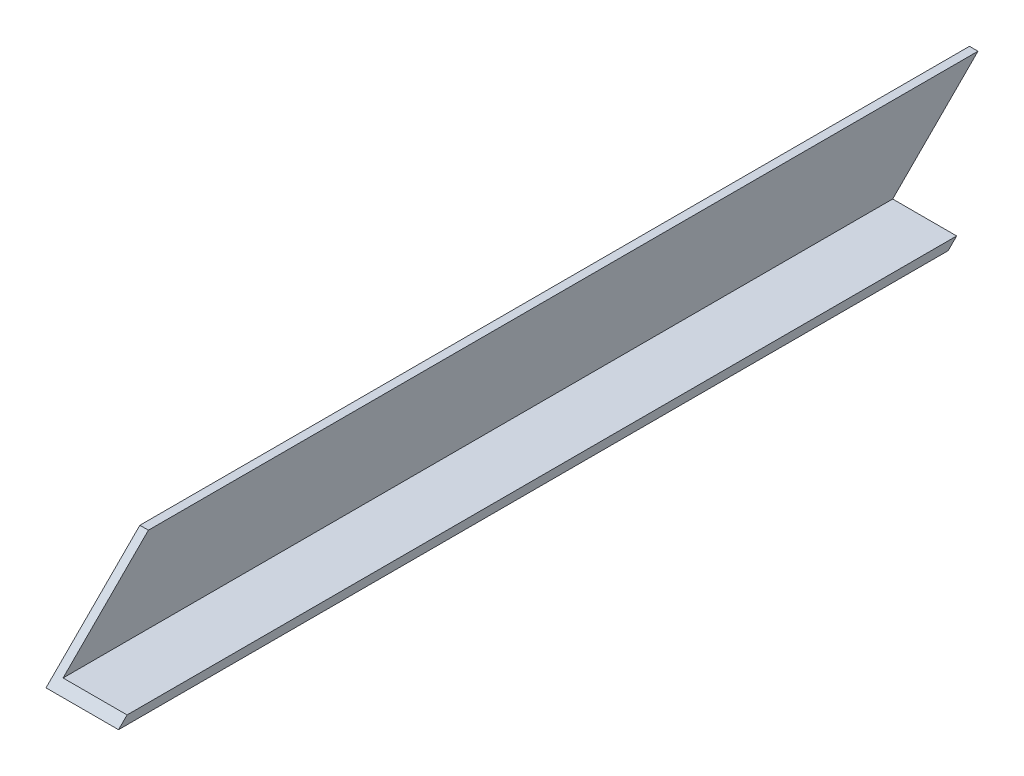
ISO-10303-21;
HEADER;
FILE_DESCRIPTION(('STEP AP214'),'2;1');
FILE_NAME('part.step','',(''),(''),'','','');
FILE_SCHEMA(('AUTOMOTIVE_DESIGN { 1 0 10303 214 1 1 1 1 }'));
ENDSEC;
DATA;
#1=APPLICATION_CONTEXT('core data for automotive mechanical design processes');
#2=APPLICATION_PROTOCOL_DEFINITION('international standard','automotive_design',2000,#1);
#3=PRODUCT_CONTEXT('',#1,'mechanical');
#4=PRODUCT('Part','Part','',(#3));
#5=PRODUCT_RELATED_PRODUCT_CATEGORY('part','',(#4));
#6=PRODUCT_DEFINITION_FORMATION('','',#4);
#7=PRODUCT_DEFINITION_CONTEXT('part definition',#1,'design');
#8=PRODUCT_DEFINITION('design','',#6,#7);
#9=PRODUCT_DEFINITION_SHAPE('','',#8);
#10=(LENGTH_UNIT() NAMED_UNIT(*) SI_UNIT(.MILLI.,.METRE.));
#11=(NAMED_UNIT(*) PLANE_ANGLE_UNIT() SI_UNIT($,.RADIAN.));
#12=(NAMED_UNIT(*) SI_UNIT($,.STERADIAN.) SOLID_ANGLE_UNIT());
#13=UNCERTAINTY_MEASURE_WITH_UNIT(LENGTH_MEASURE(1.E-05),#10,'distance_accuracy_value','');
#14=(GEOMETRIC_REPRESENTATION_CONTEXT(3) GLOBAL_UNCERTAINTY_ASSIGNED_CONTEXT((#13)) GLOBAL_UNIT_ASSIGNED_CONTEXT((#10,
#11,#12)) REPRESENTATION_CONTEXT('',''));
#15=CARTESIAN_POINT('',(0.,0.,0.));
#16=DIRECTION('',(0.,0.,1.));
#17=DIRECTION('',(1.,0.,0.));
#18=AXIS2_PLACEMENT_3D('',#15,#16,#17);
#19=CARTESIAN_POINT('',(17.,0.,250.));
#20=DIRECTION('',(0.,1.,0.));
#21=DIRECTION('',(-1.,0.,0.));
#22=AXIS2_PLACEMENT_3D('',#19,#20,#21);
#23=PLANE('',#22);
#24=DIRECTION('',(-1.,0.,0.));
#25=VECTOR('',#24,1.);
#26=CARTESIAN_POINT('',(17.,0.,55.5456351737006));
#27=LINE('',#26,#25);
#28=CARTESIAN_POINT('',(17.,0.,55.5456351737006));
#29=VERTEX_POINT('',#28);
#30=CARTESIAN_POINT('',(0.,0.,55.5456351737006));
#31=VERTEX_POINT('',#30);
#32=EDGE_CURVE('E55',#29,#31,#27,.T.);
#33=ORIENTED_EDGE('',*,*,#32,.F.);
#34=DIRECTION('',(0.,0.,-1.));
#35=VECTOR('',#34,1.);
#36=CARTESIAN_POINT('',(17.,0.,250.));
#37=LINE('',#36,#35);
#38=CARTESIAN_POINT('',(17.,0.,250.));
#39=VERTEX_POINT('',#38);
#40=EDGE_CURVE('E11',#39,#29,#37,.T.);
#41=ORIENTED_EDGE('',*,*,#40,.F.);
#42=DIRECTION('',(1.,0.,0.));
#43=VECTOR('',#42,1.);
#44=CARTESIAN_POINT('',(17.,0.,250.));
#45=LINE('',#44,#43);
#46=CARTESIAN_POINT('',(0.,0.,250.));
#47=VERTEX_POINT('',#46);
#48=EDGE_CURVE('E117',#47,#39,#45,.T.);
#49=ORIENTED_EDGE('',*,*,#48,.F.);
#50=DIRECTION('',(0.,0.,-1.));
#51=VECTOR('',#50,1.);
#52=CARTESIAN_POINT('',(0.,0.,250.));
#53=LINE('',#52,#51);
#54=EDGE_CURVE('E106',#47,#31,#53,.T.);
#55=ORIENTED_EDGE('',*,*,#54,.T.);
#56=EDGE_LOOP('',(#33,#41,#49,#55));
#57=FACE_BOUND('',#56,.T.);
#58=ADVANCED_FACE('F41',(#57),#23,.F.);
#59=CARTESIAN_POINT('',(17.,2.,250.));
#60=DIRECTION('',(-1.,0.,0.));
#61=DIRECTION('',(0.,0.,1.));
#62=AXIS2_PLACEMENT_3D('',#59,#60,#61);
#63=PLANE('',#62);
#64=DIRECTION('',(0.,0.707106781186552,-0.707106781186543));
#65=VECTOR('',#64,1.);
#66=CARTESIAN_POINT('',(17.,0.,250.));
#67=LINE('',#66,#65);
#68=CARTESIAN_POINT('',(17.,2.,248.));
#69=VERTEX_POINT('',#68);
#70=EDGE_CURVE('E99',#39,#69,#67,.T.);
#71=ORIENTED_EDGE('',*,*,#70,.F.);
#72=ORIENTED_EDGE('',*,*,#40,.T.);
#73=DIRECTION('',(0.,-0.707106781186551,0.707106781186543));
#74=VECTOR('',#73,1.);
#75=CARTESIAN_POINT('',(17.,22.,33.5456351737008));
#76=LINE('',#75,#74);
#77=CARTESIAN_POINT('',(17.,1.99999999999999,53.5456351737006));
#78=VERTEX_POINT('',#77);
#79=EDGE_CURVE('E136',#78,#29,#76,.T.);
#80=ORIENTED_EDGE('',*,*,#79,.F.);
#81=DIRECTION('',(0.,0.,-1.));
#82=VECTOR('',#81,1.);
#83=CARTESIAN_POINT('',(17.,2.,250.));
#84=LINE('',#83,#82);
#85=EDGE_CURVE('E48',#69,#78,#84,.T.);
#86=ORIENTED_EDGE('',*,*,#85,.F.);
#87=EDGE_LOOP('',(#71,#72,#80,#86));
#88=FACE_BOUND('',#87,.T.);
#89=ADVANCED_FACE('F134',(#88),#63,.F.);
#90=CARTESIAN_POINT('',(2.,2.,250.));
#91=DIRECTION('',(0.,-1.,0.));
#92=DIRECTION('',(0.,0.,-1.));
#93=AXIS2_PLACEMENT_3D('',#90,#91,#92);
#94=PLANE('',#93);
#95=DIRECTION('',(-1.,0.,0.));
#96=VECTOR('',#95,1.);
#97=CARTESIAN_POINT('',(2.,2.,248.));
#98=LINE('',#97,#96);
#99=CARTESIAN_POINT('',(2.,2.,248.));
#100=VERTEX_POINT('',#99);
#101=EDGE_CURVE('E130',#69,#100,#98,.T.);
#102=ORIENTED_EDGE('',*,*,#101,.F.);
#103=ORIENTED_EDGE('',*,*,#85,.T.);
#104=DIRECTION('',(1.,0.,0.));
#105=VECTOR('',#104,1.);
#106=CARTESIAN_POINT('',(2.00000000000003,2.,53.5456351737006));
#107=LINE('',#106,#105);
#108=CARTESIAN_POINT('',(2.,2.,53.5456351737006));
#109=VERTEX_POINT('',#108);
#110=EDGE_CURVE('E129',#109,#78,#107,.T.);
#111=ORIENTED_EDGE('',*,*,#110,.F.);
#112=DIRECTION('',(0.,0.,-1.));
#113=VECTOR('',#112,1.);
#114=CARTESIAN_POINT('',(2.,2.,250.));
#115=LINE('',#114,#113);
#116=EDGE_CURVE('E115',#100,#109,#115,.T.);
#117=ORIENTED_EDGE('',*,*,#116,.F.);
#118=EDGE_LOOP('',(#102,#103,#111,#117));
#119=FACE_BOUND('',#118,.T.);
#120=ADVANCED_FACE('F127',(#119),#94,.F.);
#121=CARTESIAN_POINT('',(2.,22.,250.));
#122=DIRECTION('',(-1.,0.,0.));
#123=DIRECTION('',(0.,-1.,0.));
#124=AXIS2_PLACEMENT_3D('',#121,#122,#123);
#125=PLANE('',#124);
#126=DIRECTION('',(0.,0.707106781186552,-0.707106781186543));
#127=VECTOR('',#126,1.);
#128=CARTESIAN_POINT('',(2.,11.0000000000001,239.));
#129=LINE('',#128,#127);
#130=CARTESIAN_POINT('',(2.,22.,228.));
#131=VERTEX_POINT('',#130);
#132=EDGE_CURVE('E94',#100,#131,#129,.T.);
#133=ORIENTED_EDGE('',*,*,#132,.F.);
#134=ORIENTED_EDGE('',*,*,#116,.T.);
#135=DIRECTION('',(0.,-0.707106781186552,0.707106781186544));
#136=VECTOR('',#135,1.);
#137=CARTESIAN_POINT('',(2.00000000000001,-86.2271824131496,141.772817586849));
#138=LINE('',#137,#136);
#139=CARTESIAN_POINT('',(2.,22.,33.5456351737008));
#140=VERTEX_POINT('',#139);
#141=EDGE_CURVE('E144',#140,#109,#138,.T.);
#142=ORIENTED_EDGE('',*,*,#141,.F.);
#143=DIRECTION('',(0.,0.,-1.));
#144=VECTOR('',#143,1.);
#145=CARTESIAN_POINT('',(2.,22.,250.));
#146=LINE('',#145,#144);
#147=EDGE_CURVE('E113',#131,#140,#146,.T.);
#148=ORIENTED_EDGE('',*,*,#147,.F.);
#149=EDGE_LOOP('',(#133,#134,#142,#148));
#150=FACE_BOUND('',#149,.T.);
#151=ADVANCED_FACE('F154',(#150),#125,.F.);
#152=CARTESIAN_POINT('',(0.,22.,250.));
#153=DIRECTION('',(0.,-1.,0.));
#154=DIRECTION('',(0.,0.,-1.));
#155=AXIS2_PLACEMENT_3D('',#152,#153,#154);
#156=PLANE('',#155);
#157=DIRECTION('',(-1.,0.,0.));
#158=VECTOR('',#157,1.);
#159=CARTESIAN_POINT('',(17.,22.,228.));
#160=LINE('',#159,#158);
#161=CARTESIAN_POINT('',(0.,22.,228.));
#162=VERTEX_POINT('',#161);
#163=EDGE_CURVE('E91',#131,#162,#160,.T.);
#164=ORIENTED_EDGE('',*,*,#163,.F.);
#165=ORIENTED_EDGE('',*,*,#147,.T.);
#166=DIRECTION('',(-1.,0.,0.));
#167=VECTOR('',#166,1.);
#168=CARTESIAN_POINT('',(17.,22.,33.5456351737008));
#169=LINE('',#168,#167);
#170=CARTESIAN_POINT('',(0.,22.,33.5456351737008));
#171=VERTEX_POINT('',#170);
#172=EDGE_CURVE('E112',#140,#171,#169,.T.);
#173=ORIENTED_EDGE('',*,*,#172,.T.);
#174=DIRECTION('',(0.,0.,-1.));
#175=VECTOR('',#174,1.);
#176=CARTESIAN_POINT('',(0.,22.,250.));
#177=LINE('',#176,#175);
#178=EDGE_CURVE('E104',#162,#171,#177,.T.);
#179=ORIENTED_EDGE('',*,*,#178,.F.);
#180=EDGE_LOOP('',(#164,#165,#173,#179));
#181=FACE_BOUND('',#180,.T.);
#182=ADVANCED_FACE('F111',(#181),#156,.F.);
#183=CARTESIAN_POINT('',(0.,0.,250.));
#184=DIRECTION('',(1.,0.,0.));
#185=DIRECTION('',(0.,0.,-1.));
#186=AXIS2_PLACEMENT_3D('',#183,#184,#185);
#187=PLANE('',#186);
#188=DIRECTION('',(0.,0.707106781186552,-0.707106781186543));
#189=VECTOR('',#188,1.);
#190=CARTESIAN_POINT('',(0.,0.,250.));
#191=LINE('',#190,#189);
#192=EDGE_CURVE('E63',#47,#162,#191,.T.);
#193=ORIENTED_EDGE('',*,*,#192,.T.);
#194=ORIENTED_EDGE('',*,*,#178,.T.);
#195=DIRECTION('',(0.,-0.707106781186551,0.707106781186543));
#196=VECTOR('',#195,1.);
#197=CARTESIAN_POINT('',(0.,22.,33.5456351737008));
#198=LINE('',#197,#196);
#199=EDGE_CURVE('E108',#171,#31,#198,.T.);
#200=ORIENTED_EDGE('',*,*,#199,.T.);
#201=ORIENTED_EDGE('',*,*,#54,.F.);
#202=EDGE_LOOP('',(#193,#194,#200,#201));
#203=FACE_BOUND('',#202,.T.);
#204=ADVANCED_FACE('F103',(#203),#187,.F.);
#205=CARTESIAN_POINT('',(17.,0.,250.));
#206=DIRECTION('',(0.,0.707106781186543,0.707106781186552));
#207=DIRECTION('',(0.,-0.707106781186552,0.707106781186543));
#208=AXIS2_PLACEMENT_3D('',#205,#206,#207);
#209=PLANE('',#208);
#210=ORIENTED_EDGE('',*,*,#101,.T.);
#211=ORIENTED_EDGE('',*,*,#132,.T.);
#212=ORIENTED_EDGE('',*,*,#163,.T.);
#213=ORIENTED_EDGE('',*,*,#192,.F.);
#214=ORIENTED_EDGE('',*,*,#48,.T.);
#215=ORIENTED_EDGE('',*,*,#70,.T.);
#216=EDGE_LOOP('',(#210,#211,#212,#213,#214,#215));
#217=FACE_BOUND('',#216,.T.);
#218=ADVANCED_FACE('F92',(#217),#209,.T.);
#219=CARTESIAN_POINT('',(17.,22.,33.5456351737008));
#220=DIRECTION('',(0.,-0.707106781186544,-0.707106781186552));
#221=DIRECTION('',(0.,0.707106781186552,-0.707106781186544));
#222=AXIS2_PLACEMENT_3D('',#219,#220,#221);
#223=PLANE('',#222);
#224=ORIENTED_EDGE('',*,*,#110,.T.);
#225=ORIENTED_EDGE('',*,*,#79,.T.);
#226=ORIENTED_EDGE('',*,*,#32,.T.);
#227=ORIENTED_EDGE('',*,*,#199,.F.);
#228=ORIENTED_EDGE('',*,*,#172,.F.);
#229=ORIENTED_EDGE('',*,*,#141,.T.);
#230=EDGE_LOOP('',(#224,#225,#226,#227,#228,#229));
#231=FACE_BOUND('',#230,.T.);
#232=ADVANCED_FACE('F164',(#231),#223,.T.);
#233=CLOSED_SHELL('',(#58,#89,#120,#151,#182,#204,#218,#232));
#234=MANIFOLD_SOLID_BREP('B2',#233);
#235=ADVANCED_BREP_SHAPE_REPRESENTATION('',(#18,#234),#14);
#236=SHAPE_DEFINITION_REPRESENTATION(#9,#235);
ENDSEC;
END-ISO-10303-21;
